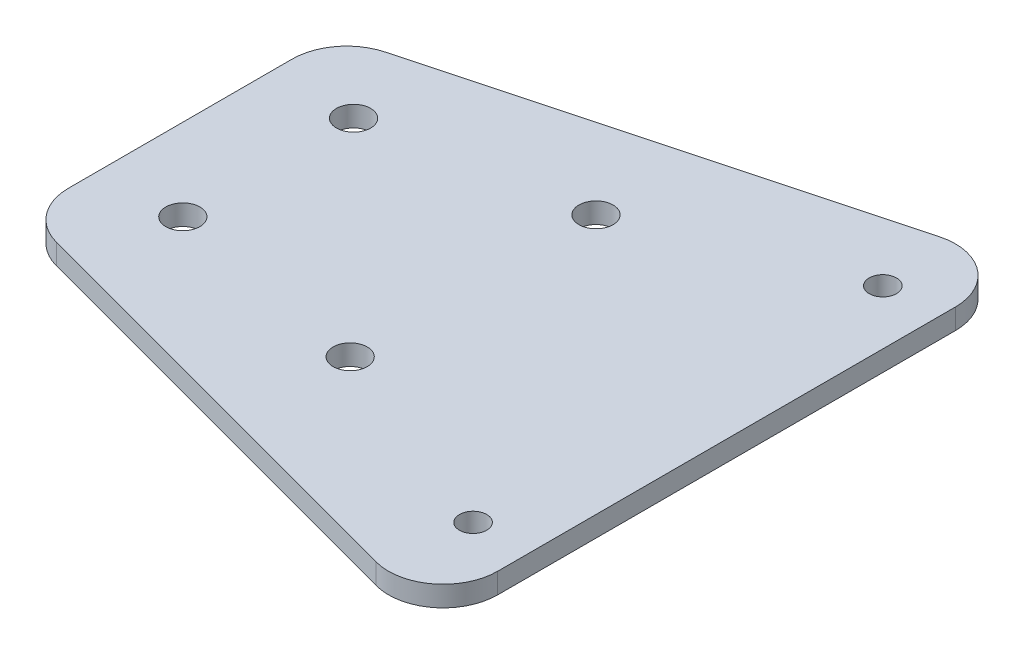
ISO-10303-21;
HEADER;
FILE_DESCRIPTION(('STEP AP214'),'2;1');
FILE_NAME('part.step','',(''),(''),'','','');
FILE_SCHEMA(('AUTOMOTIVE_DESIGN { 1 0 10303 214 1 1 1 1 }'));
ENDSEC;
DATA;
#1=APPLICATION_CONTEXT('core data for automotive mechanical design processes');
#2=APPLICATION_PROTOCOL_DEFINITION('international standard','automotive_design',2000,#1);
#3=PRODUCT_CONTEXT('',#1,'mechanical');
#4=PRODUCT('Part','Part','',(#3));
#5=PRODUCT_RELATED_PRODUCT_CATEGORY('part','',(#4));
#6=PRODUCT_DEFINITION_FORMATION('','',#4);
#7=PRODUCT_DEFINITION_CONTEXT('part definition',#1,'design');
#8=PRODUCT_DEFINITION('design','',#6,#7);
#9=PRODUCT_DEFINITION_SHAPE('','',#8);
#10=(LENGTH_UNIT() NAMED_UNIT(*) SI_UNIT(.MILLI.,.METRE.));
#11=(NAMED_UNIT(*) PLANE_ANGLE_UNIT() SI_UNIT($,.RADIAN.));
#12=(NAMED_UNIT(*) SI_UNIT($,.STERADIAN.) SOLID_ANGLE_UNIT());
#13=UNCERTAINTY_MEASURE_WITH_UNIT(LENGTH_MEASURE(1.E-05),#10,'distance_accuracy_value','');
#14=(GEOMETRIC_REPRESENTATION_CONTEXT(3) GLOBAL_UNCERTAINTY_ASSIGNED_CONTEXT((#13)) GLOBAL_UNIT_ASSIGNED_CONTEXT((#10,
#11,#12)) REPRESENTATION_CONTEXT('',''));
#15=CARTESIAN_POINT('',(0.,0.,0.));
#16=DIRECTION('',(0.,0.,1.));
#17=DIRECTION('',(1.,0.,0.));
#18=AXIS2_PLACEMENT_3D('',#15,#16,#17);
#19=CARTESIAN_POINT('',(-33.4204545454545,1.5,-20.3806449125593));
#20=DIRECTION('',(0.,-1.,0.));
#21=DIRECTION('',(0.,0.,-1.));
#22=AXIS2_PLACEMENT_3D('',#19,#20,#21);
#23=CYLINDRICAL_SURFACE('',#22,8.);
#24=CARTESIAN_POINT('',(-33.4204545454545,-1.5,-20.3806449125593));
#25=DIRECTION('',(0.,1.,0.));
#26=DIRECTION('',(0.,0.,-1.));
#27=AXIS2_PLACEMENT_3D('',#24,#25,#26);
#28=CIRCLE('',#27,8.);
#29=CARTESIAN_POINT('',(-35.4913732101058,-1.5,-28.1079533627506));
#30=VERTEX_POINT('',#29);
#31=CARTESIAN_POINT('',(-41.4204545454545,-1.5,-20.3806449125592));
#32=VERTEX_POINT('',#31);
#33=EDGE_CURVE('E140',#30,#32,#28,.T.);
#34=ORIENTED_EDGE('',*,*,#33,.T.);
#35=DIRECTION('',(0.,-1.,0.));
#36=VECTOR('',#35,1.);
#37=CARTESIAN_POINT('',(-41.4204545454545,1.5,-20.3806449125592));
#38=LINE('',#37,#36);
#39=CARTESIAN_POINT('',(-41.4204545454545,1.5,-20.3806449125592));
#40=VERTEX_POINT('',#39);
#41=EDGE_CURVE('E11',#40,#32,#38,.T.);
#42=ORIENTED_EDGE('',*,*,#41,.F.);
#43=CARTESIAN_POINT('',(-33.4204545454545,1.5,-20.3806449125593));
#44=DIRECTION('',(0.,1.,0.));
#45=DIRECTION('',(0.,0.,-1.));
#46=AXIS2_PLACEMENT_3D('',#43,#44,#45);
#47=CIRCLE('',#46,8.);
#48=CARTESIAN_POINT('',(-35.4913732101058,1.5,-28.1079533627506));
#49=VERTEX_POINT('',#48);
#50=EDGE_CURVE('E155',#49,#40,#47,.T.);
#51=ORIENTED_EDGE('',*,*,#50,.F.);
#52=DIRECTION('',(0.,-1.,0.));
#53=VECTOR('',#52,1.);
#54=CARTESIAN_POINT('',(-35.4913732101058,1.5,-28.1079533627506));
#55=LINE('',#54,#53);
#56=EDGE_CURVE('E133',#49,#30,#55,.T.);
#57=ORIENTED_EDGE('',*,*,#56,.T.);
#58=EDGE_LOOP('',(#34,#42,#51,#57));
#59=FACE_BOUND('',#58,.T.);
#60=ADVANCED_FACE('F41',(#59),#23,.T.);
#61=CARTESIAN_POINT('',(-41.4204545454545,1.5,12.3427257828049));
#62=DIRECTION('',(1.,0.,0.));
#63=DIRECTION('',(0.,0.,-1.));
#64=AXIS2_PLACEMENT_3D('',#61,#62,#63);
#65=PLANE('',#64);
#66=DIRECTION('',(0.,0.,1.));
#67=VECTOR('',#66,1.);
#68=CARTESIAN_POINT('',(-41.4204545454545,-1.5,12.3427257828049));
#69=LINE('',#68,#67);
#70=CARTESIAN_POINT('',(-41.4204545454545,-1.5,12.3427257828049));
#71=VERTEX_POINT('',#70);
#72=EDGE_CURVE('E139',#32,#71,#69,.T.);
#73=ORIENTED_EDGE('',*,*,#72,.T.);
#74=DIRECTION('',(0.,-1.,0.));
#75=VECTOR('',#74,1.);
#76=CARTESIAN_POINT('',(-41.4204545454545,1.5,12.3427257828049));
#77=LINE('',#76,#75);
#78=CARTESIAN_POINT('',(-41.4204545454545,1.5,12.3427257828049));
#79=VERTEX_POINT('',#78);
#80=EDGE_CURVE('E47',#79,#71,#77,.T.);
#81=ORIENTED_EDGE('',*,*,#80,.F.);
#82=DIRECTION('',(0.,0.,1.));
#83=VECTOR('',#82,1.);
#84=CARTESIAN_POINT('',(-41.4204545454545,1.5,12.3427257828049));
#85=LINE('',#84,#83);
#86=EDGE_CURVE('E99',#40,#79,#85,.T.);
#87=ORIENTED_EDGE('',*,*,#86,.F.);
#88=ORIENTED_EDGE('',*,*,#41,.T.);
#89=EDGE_LOOP('',(#73,#81,#87,#88));
#90=FACE_BOUND('',#89,.T.);
#91=ADVANCED_FACE('F263',(#90),#65,.F.);
#92=CARTESIAN_POINT('',(-33.4204545454545,1.5,12.3427257828049));
#93=DIRECTION('',(0.,-1.,0.));
#94=DIRECTION('',(0.,0.,-1.));
#95=AXIS2_PLACEMENT_3D('',#92,#93,#94);
#96=CYLINDRICAL_SURFACE('',#95,8.);
#97=CARTESIAN_POINT('',(-33.4204545454545,-1.5,12.3427257828049));
#98=DIRECTION('',(0.,1.,0.));
#99=DIRECTION('',(0.,0.,1.));
#100=AXIS2_PLACEMENT_3D('',#97,#98,#99);
#101=CIRCLE('',#100,8.);
#102=CARTESIAN_POINT('',(-35.4913732101058,-1.5,20.0700342329963));
#103=VERTEX_POINT('',#102);
#104=EDGE_CURVE('E142',#71,#103,#101,.T.);
#105=ORIENTED_EDGE('',*,*,#104,.T.);
#106=DIRECTION('',(0.,-1.,0.));
#107=VECTOR('',#106,1.);
#108=CARTESIAN_POINT('',(-35.4913732101058,1.5,20.0700342329963));
#109=LINE('',#108,#107);
#110=CARTESIAN_POINT('',(-35.4913732101058,1.5,20.0700342329963));
#111=VERTEX_POINT('',#110);
#112=EDGE_CURVE('E159',#111,#103,#109,.T.);
#113=ORIENTED_EDGE('',*,*,#112,.F.);
#114=CARTESIAN_POINT('',(-33.4204545454545,1.5,12.3427257828049));
#115=DIRECTION('',(0.,1.,0.));
#116=DIRECTION('',(0.,0.,1.));
#117=AXIS2_PLACEMENT_3D('',#114,#115,#116);
#118=CIRCLE('',#117,8.);
#119=EDGE_CURVE('E167',#79,#111,#118,.T.);
#120=ORIENTED_EDGE('',*,*,#119,.F.);
#121=ORIENTED_EDGE('',*,*,#80,.T.);
#122=EDGE_LOOP('',(#105,#113,#120,#121));
#123=FACE_BOUND('',#122,.T.);
#124=ADVANCED_FACE('F161',(#123),#96,.T.);
#125=CARTESIAN_POINT('',(-35.4913732101058,1.5,20.0700342329963));
#126=DIRECTION('',(0.258864833081411,0.,-0.965913556273921));
#127=DIRECTION('',(-0.965913556273921,0.,-0.258864833081411));
#128=AXIS2_PLACEMENT_3D('',#125,#126,#127);
#129=PLANE('',#128);
#130=DIRECTION('',(0.965913556273921,0.,0.258864833081411));
#131=VECTOR('',#130,1.);
#132=CARTESIAN_POINT('',(-35.4913732101058,-1.5,20.0700342329963));
#133=LINE('',#132,#131);
#134=CARTESIAN_POINT('',(28.5086267898941,-1.5,37.2220342329963));
#135=VERTEX_POINT('',#134);
#136=EDGE_CURVE('E144',#103,#135,#133,.T.);
#137=ORIENTED_EDGE('',*,*,#136,.T.);
#138=DIRECTION('',(0.,-1.,0.));
#139=VECTOR('',#138,1.);
#140=CARTESIAN_POINT('',(28.5086267898941,1.5,37.2220342329963));
#141=LINE('',#140,#139);
#142=CARTESIAN_POINT('',(28.5086267898941,1.5,37.2220342329963));
#143=VERTEX_POINT('',#142);
#144=EDGE_CURVE('E157',#143,#135,#141,.T.);
#145=ORIENTED_EDGE('',*,*,#144,.F.);
#146=DIRECTION('',(0.965913556273921,0.,0.258864833081411));
#147=VECTOR('',#146,1.);
#148=CARTESIAN_POINT('',(-35.4913732101058,1.5,20.0700342329963));
#149=LINE('',#148,#147);
#150=EDGE_CURVE('E177',#111,#143,#149,.T.);
#151=ORIENTED_EDGE('',*,*,#150,.F.);
#152=ORIENTED_EDGE('',*,*,#112,.T.);
#153=EDGE_LOOP('',(#137,#145,#151,#152));
#154=FACE_BOUND('',#153,.T.);
#155=ADVANCED_FACE('F172',(#154),#129,.F.);
#156=CARTESIAN_POINT('',(30.5795454545455,1.5,29.4947257828049));
#157=DIRECTION('',(0.,-1.,0.));
#158=DIRECTION('',(0.,0.,-1.));
#159=AXIS2_PLACEMENT_3D('',#156,#157,#158);
#160=CYLINDRICAL_SURFACE('',#159,8.);
#161=CARTESIAN_POINT('',(30.5795454545455,-1.5,29.4947257828049));
#162=DIRECTION('',(0.,1.,0.));
#163=DIRECTION('',(0.,0.,1.));
#164=AXIS2_PLACEMENT_3D('',#161,#162,#163);
#165=CIRCLE('',#164,8.);
#166=CARTESIAN_POINT('',(38.5795454545455,-1.5,29.4947257828048));
#167=VERTEX_POINT('',#166);
#168=EDGE_CURVE('E150',#135,#167,#165,.T.);
#169=ORIENTED_EDGE('',*,*,#168,.T.);
#170=DIRECTION('',(0.,-1.,0.));
#171=VECTOR('',#170,1.);
#172=CARTESIAN_POINT('',(38.5795454545455,1.5,29.4947257828048));
#173=LINE('',#172,#171);
#174=CARTESIAN_POINT('',(38.5795454545455,1.5,29.4947257828048));
#175=VERTEX_POINT('',#174);
#176=EDGE_CURVE('E126',#175,#167,#173,.T.);
#177=ORIENTED_EDGE('',*,*,#176,.F.);
#178=CARTESIAN_POINT('',(30.5795454545455,1.5,29.4947257828049));
#179=DIRECTION('',(0.,1.,0.));
#180=DIRECTION('',(0.,0.,1.));
#181=AXIS2_PLACEMENT_3D('',#178,#179,#180);
#182=CIRCLE('',#181,8.);
#183=EDGE_CURVE('E119',#143,#175,#182,.T.);
#184=ORIENTED_EDGE('',*,*,#183,.F.);
#185=ORIENTED_EDGE('',*,*,#144,.T.);
#186=EDGE_LOOP('',(#169,#177,#184,#185));
#187=FACE_BOUND('',#186,.T.);
#188=ADVANCED_FACE('F178',(#187),#160,.T.);
#189=CARTESIAN_POINT('',(38.5795454545455,1.5,-37.5326449125592));
#190=DIRECTION('',(-1.,0.,0.));
#191=DIRECTION('',(0.,0.,1.));
#192=AXIS2_PLACEMENT_3D('',#189,#190,#191);
#193=PLANE('',#192);
#194=DIRECTION('',(0.,0.,-1.));
#195=VECTOR('',#194,1.);
#196=CARTESIAN_POINT('',(38.5795454545455,-1.5,-37.5326449125592));
#197=LINE('',#196,#195);
#198=CARTESIAN_POINT('',(38.5795454545455,-1.5,-37.5326449125592));
#199=VERTEX_POINT('',#198);
#200=EDGE_CURVE('E130',#167,#199,#197,.T.);
#201=ORIENTED_EDGE('',*,*,#200,.T.);
#202=DIRECTION('',(0.,-1.,0.));
#203=VECTOR('',#202,1.);
#204=CARTESIAN_POINT('',(38.5795454545455,1.5,-37.5326449125592));
#205=LINE('',#204,#203);
#206=CARTESIAN_POINT('',(38.5795454545455,1.5,-37.5326449125592));
#207=VERTEX_POINT('',#206);
#208=EDGE_CURVE('E125',#207,#199,#205,.T.);
#209=ORIENTED_EDGE('',*,*,#208,.F.);
#210=DIRECTION('',(0.,0.,-1.));
#211=VECTOR('',#210,1.);
#212=CARTESIAN_POINT('',(38.5795454545455,1.5,-37.5326449125592));
#213=LINE('',#212,#211);
#214=EDGE_CURVE('E111',#175,#207,#213,.T.);
#215=ORIENTED_EDGE('',*,*,#214,.F.);
#216=ORIENTED_EDGE('',*,*,#176,.T.);
#217=EDGE_LOOP('',(#201,#209,#215,#216));
#218=FACE_BOUND('',#217,.T.);
#219=ADVANCED_FACE('F124',(#218),#193,.F.);
#220=CARTESIAN_POINT('',(30.5795454545455,1.5,-37.5326449125593));
#221=DIRECTION('',(0.,-1.,0.));
#222=DIRECTION('',(0.,0.,-1.));
#223=AXIS2_PLACEMENT_3D('',#220,#221,#222);
#224=CYLINDRICAL_SURFACE('',#223,8.);
#225=CARTESIAN_POINT('',(30.5795454545455,-1.5,-37.5326449125593));
#226=DIRECTION('',(0.,1.,0.));
#227=DIRECTION('',(0.,0.,-1.));
#228=AXIS2_PLACEMENT_3D('',#225,#226,#227);
#229=CIRCLE('',#228,8.);
#230=CARTESIAN_POINT('',(28.5086267898941,-1.5,-45.2599533627506));
#231=VERTEX_POINT('',#230);
#232=EDGE_CURVE('E86',#199,#231,#229,.T.);
#233=ORIENTED_EDGE('',*,*,#232,.T.);
#234=DIRECTION('',(0.,-1.,0.));
#235=VECTOR('',#234,1.);
#236=CARTESIAN_POINT('',(28.5086267898941,1.5,-45.2599533627506));
#237=LINE('',#236,#235);
#238=CARTESIAN_POINT('',(28.5086267898941,1.5,-45.2599533627506));
#239=VERTEX_POINT('',#238);
#240=EDGE_CURVE('E129',#239,#231,#237,.T.);
#241=ORIENTED_EDGE('',*,*,#240,.F.);
#242=CARTESIAN_POINT('',(30.5795454545455,1.5,-37.5326449125593));
#243=DIRECTION('',(0.,1.,0.));
#244=DIRECTION('',(0.,0.,-1.));
#245=AXIS2_PLACEMENT_3D('',#242,#243,#244);
#246=CIRCLE('',#245,8.);
#247=EDGE_CURVE('E120',#207,#239,#246,.T.);
#248=ORIENTED_EDGE('',*,*,#247,.F.);
#249=ORIENTED_EDGE('',*,*,#208,.T.);
#250=EDGE_LOOP('',(#233,#241,#248,#249));
#251=FACE_BOUND('',#250,.T.);
#252=ADVANCED_FACE('F131',(#251),#224,.T.);
#253=CARTESIAN_POINT('',(-35.4913732101058,1.5,-28.1079533627506));
#254=DIRECTION('',(0.258864833081411,0.,0.965913556273921));
#255=DIRECTION('',(0.965913556273921,0.,-0.258864833081411));
#256=AXIS2_PLACEMENT_3D('',#253,#254,#255);
#257=PLANE('',#256);
#258=DIRECTION('',(-0.965913556273921,0.,0.258864833081411));
#259=VECTOR('',#258,1.);
#260=CARTESIAN_POINT('',(-35.4913732101058,-1.5,-28.1079533627506));
#261=LINE('',#260,#259);
#262=EDGE_CURVE('E95',#231,#30,#261,.T.);
#263=ORIENTED_EDGE('',*,*,#262,.T.);
#264=ORIENTED_EDGE('',*,*,#56,.F.);
#265=DIRECTION('',(-0.965913556273921,0.,0.258864833081411));
#266=VECTOR('',#265,1.);
#267=CARTESIAN_POINT('',(-35.4913732101058,1.5,-28.1079533627506));
#268=LINE('',#267,#266);
#269=EDGE_CURVE('E60',#239,#49,#268,.T.);
#270=ORIENTED_EDGE('',*,*,#269,.F.);
#271=ORIENTED_EDGE('',*,*,#240,.T.);
#272=EDGE_LOOP('',(#263,#264,#270,#271));
#273=FACE_BOUND('',#272,.T.);
#274=ADVANCED_FACE('F235',(#273),#257,.F.);
#275=CARTESIAN_POINT('',(-33.4204545454545,1.5,-20.3806449125593));
#276=DIRECTION('',(0.,-1.,0.));
#277=DIRECTION('',(0.,0.,-1.));
#278=AXIS2_PLACEMENT_3D('',#275,#276,#277);
#279=PLANE('',#278);
#280=CARTESIAN_POINT('',(30.5795454545455,1.5,-34.8941525518892));
#281=DIRECTION('',(0.,1.,0.));
#282=DIRECTION('',(0.,0.,1.));
#283=AXIS2_PLACEMENT_3D('',#280,#281,#282);
#284=CIRCLE('',#283,2.);
#285=CARTESIAN_POINT('',(30.5795454545455,1.5,-32.8941525518892));
#286=VERTEX_POINT('',#285);
#287=EDGE_CURVE('E206',#286,#286,#284,.T.);
#288=ORIENTED_EDGE('',*,*,#287,.F.);
#289=EDGE_LOOP('',(#288));
#290=FACE_BOUND('',#289,.T.);
#291=CARTESIAN_POINT('',(-29.4204545454545,1.5,7.60584744811078));
#292=DIRECTION('',(0.,1.,0.));
#293=DIRECTION('',(0.,0.,-1.));
#294=AXIS2_PLACEMENT_3D('',#291,#292,#293);
#295=CIRCLE('',#294,2.5);
#296=CARTESIAN_POINT('',(-29.4204545454545,1.5,5.10584744811078));
#297=VERTEX_POINT('',#296);
#298=EDGE_CURVE('E188',#297,#297,#295,.T.);
#299=ORIENTED_EDGE('',*,*,#298,.F.);
#300=EDGE_LOOP('',(#299));
#301=FACE_BOUND('',#300,.T.);
#302=CARTESIAN_POINT('',(0.579545454545478,1.5,13.1058474481108));
#303=DIRECTION('',(0.,1.,0.));
#304=DIRECTION('',(0.,0.,-1.));
#305=AXIS2_PLACEMENT_3D('',#302,#303,#304);
#306=CIRCLE('',#305,2.5);
#307=CARTESIAN_POINT('',(0.579545454545478,1.5,10.6058474481108));
#308=VERTEX_POINT('',#307);
#309=EDGE_CURVE('E187',#308,#308,#306,.T.);
#310=ORIENTED_EDGE('',*,*,#309,.F.);
#311=EDGE_LOOP('',(#310));
#312=FACE_BOUND('',#311,.T.);
#313=CARTESIAN_POINT('',(30.5795454545455,1.5,25.1058474481108));
#314=DIRECTION('',(0.,1.,0.));
#315=DIRECTION('',(0.,0.,-1.));
#316=AXIS2_PLACEMENT_3D('',#313,#314,#315);
#317=CIRCLE('',#316,2.);
#318=CARTESIAN_POINT('',(30.5795454545455,1.5,23.1058474481108));
#319=VERTEX_POINT('',#318);
#320=EDGE_CURVE('E193',#319,#319,#317,.T.);
#321=ORIENTED_EDGE('',*,*,#320,.F.);
#322=EDGE_LOOP('',(#321));
#323=FACE_BOUND('',#322,.T.);
#324=CARTESIAN_POINT('',(-29.4204545454545,1.5,-17.3941525518892));
#325=DIRECTION('',(0.,1.,0.));
#326=DIRECTION('',(0.,0.,1.));
#327=AXIS2_PLACEMENT_3D('',#324,#325,#326);
#328=CIRCLE('',#327,2.5);
#329=CARTESIAN_POINT('',(-29.4204545454545,1.5,-14.8941525518892));
#330=VERTEX_POINT('',#329);
#331=EDGE_CURVE('E202',#330,#330,#328,.T.);
#332=ORIENTED_EDGE('',*,*,#331,.F.);
#333=EDGE_LOOP('',(#332));
#334=FACE_BOUND('',#333,.T.);
#335=CARTESIAN_POINT('',(0.579545454545478,1.5,-22.8941525518892));
#336=DIRECTION('',(0.,1.,0.));
#337=DIRECTION('',(0.,0.,1.));
#338=AXIS2_PLACEMENT_3D('',#335,#336,#337);
#339=CIRCLE('',#338,2.5);
#340=CARTESIAN_POINT('',(0.579545454545478,1.5,-20.3941525518892));
#341=VERTEX_POINT('',#340);
#342=EDGE_CURVE('E210',#341,#341,#339,.T.);
#343=ORIENTED_EDGE('',*,*,#342,.F.);
#344=EDGE_LOOP('',(#343));
#345=FACE_BOUND('',#344,.T.);
#346=ORIENTED_EDGE('',*,*,#50,.T.);
#347=ORIENTED_EDGE('',*,*,#86,.T.);
#348=ORIENTED_EDGE('',*,*,#119,.T.);
#349=ORIENTED_EDGE('',*,*,#150,.T.);
#350=ORIENTED_EDGE('',*,*,#183,.T.);
#351=ORIENTED_EDGE('',*,*,#214,.T.);
#352=ORIENTED_EDGE('',*,*,#247,.T.);
#353=ORIENTED_EDGE('',*,*,#269,.T.);
#354=EDGE_LOOP('',(#346,#347,#348,#349,#350,#351,#352,#353));
#355=FACE_BOUND('',#354,.T.);
#356=ADVANCED_FACE('F113',(#290,#301,#312,#323,#334,#345,#355),#279,.F.);
#357=CARTESIAN_POINT('',(-33.4204545454545,-1.5,-20.3806449125593));
#358=DIRECTION('',(0.,-1.,0.));
#359=DIRECTION('',(0.,0.,-1.));
#360=AXIS2_PLACEMENT_3D('',#357,#358,#359);
#361=PLANE('',#360);
#362=CARTESIAN_POINT('',(30.5795454545455,-1.5,-34.8941525518892));
#363=DIRECTION('',(0.,1.,0.));
#364=DIRECTION('',(0.,0.,1.));
#365=AXIS2_PLACEMENT_3D('',#362,#363,#364);
#366=CIRCLE('',#365,2.);
#367=CARTESIAN_POINT('',(30.5795454545455,-1.5,-32.8941525518892));
#368=VERTEX_POINT('',#367);
#369=EDGE_CURVE('E141',#368,#368,#366,.T.);
#370=ORIENTED_EDGE('',*,*,#369,.T.);
#371=EDGE_LOOP('',(#370));
#372=FACE_BOUND('',#371,.T.);
#373=CARTESIAN_POINT('',(-29.4204545454545,-1.5,7.60584744811078));
#374=DIRECTION('',(0.,1.,0.));
#375=DIRECTION('',(0.,0.,-1.));
#376=AXIS2_PLACEMENT_3D('',#373,#374,#375);
#377=CIRCLE('',#376,2.5);
#378=CARTESIAN_POINT('',(-29.4204545454545,-1.5,5.10584744811078));
#379=VERTEX_POINT('',#378);
#380=EDGE_CURVE('E213',#379,#379,#377,.T.);
#381=ORIENTED_EDGE('',*,*,#380,.T.);
#382=EDGE_LOOP('',(#381));
#383=FACE_BOUND('',#382,.T.);
#384=CARTESIAN_POINT('',(0.579545454545478,-1.5,13.1058474481108));
#385=DIRECTION('',(0.,1.,0.));
#386=DIRECTION('',(0.,0.,-1.));
#387=AXIS2_PLACEMENT_3D('',#384,#385,#386);
#388=CIRCLE('',#387,2.5);
#389=CARTESIAN_POINT('',(0.579545454545478,-1.5,10.6058474481108));
#390=VERTEX_POINT('',#389);
#391=EDGE_CURVE('E184',#390,#390,#388,.T.);
#392=ORIENTED_EDGE('',*,*,#391,.T.);
#393=EDGE_LOOP('',(#392));
#394=FACE_BOUND('',#393,.T.);
#395=CARTESIAN_POINT('',(30.5795454545455,-1.5,25.1058474481108));
#396=DIRECTION('',(0.,1.,0.));
#397=DIRECTION('',(0.,0.,-1.));
#398=AXIS2_PLACEMENT_3D('',#395,#396,#397);
#399=CIRCLE('',#398,2.);
#400=CARTESIAN_POINT('',(30.5795454545455,-1.5,23.1058474481108));
#401=VERTEX_POINT('',#400);
#402=EDGE_CURVE('E195',#401,#401,#399,.T.);
#403=ORIENTED_EDGE('',*,*,#402,.T.);
#404=EDGE_LOOP('',(#403));
#405=FACE_BOUND('',#404,.T.);
#406=CARTESIAN_POINT('',(-29.4204545454545,-1.5,-17.3941525518892));
#407=DIRECTION('',(0.,1.,0.));
#408=DIRECTION('',(0.,0.,1.));
#409=AXIS2_PLACEMENT_3D('',#406,#407,#408);
#410=CIRCLE('',#409,2.5);
#411=CARTESIAN_POINT('',(-29.4204545454545,-1.5,-14.8941525518892));
#412=VERTEX_POINT('',#411);
#413=EDGE_CURVE('E198',#412,#412,#410,.T.);
#414=ORIENTED_EDGE('',*,*,#413,.T.);
#415=EDGE_LOOP('',(#414));
#416=FACE_BOUND('',#415,.T.);
#417=CARTESIAN_POINT('',(0.579545454545478,-1.5,-22.8941525518892));
#418=DIRECTION('',(0.,1.,0.));
#419=DIRECTION('',(0.,0.,1.));
#420=AXIS2_PLACEMENT_3D('',#417,#418,#419);
#421=CIRCLE('',#420,2.5);
#422=CARTESIAN_POINT('',(0.579545454545478,-1.5,-20.3941525518892));
#423=VERTEX_POINT('',#422);
#424=EDGE_CURVE('E204',#423,#423,#421,.T.);
#425=ORIENTED_EDGE('',*,*,#424,.T.);
#426=EDGE_LOOP('',(#425));
#427=FACE_BOUND('',#426,.T.);
#428=ORIENTED_EDGE('',*,*,#33,.F.);
#429=ORIENTED_EDGE('',*,*,#262,.F.);
#430=ORIENTED_EDGE('',*,*,#232,.F.);
#431=ORIENTED_EDGE('',*,*,#200,.F.);
#432=ORIENTED_EDGE('',*,*,#168,.F.);
#433=ORIENTED_EDGE('',*,*,#136,.F.);
#434=ORIENTED_EDGE('',*,*,#104,.F.);
#435=ORIENTED_EDGE('',*,*,#72,.F.);
#436=EDGE_LOOP('',(#428,#429,#430,#431,#432,#433,#434,#435));
#437=FACE_BOUND('',#436,.T.);
#438=ADVANCED_FACE('F173',(#372,#383,#394,#405,#416,#427,#437),#361,.T.);
#439=CARTESIAN_POINT('',(0.579545454545478,-1.5,-22.8941525518892));
#440=DIRECTION('',(0.,1.,0.));
#441=DIRECTION('',(0.,0.,1.));
#442=AXIS2_PLACEMENT_3D('',#439,#440,#441);
#443=CYLINDRICAL_SURFACE('',#442,2.5);
#444=ORIENTED_EDGE('',*,*,#424,.F.);
#445=EDGE_LOOP('',(#444));
#446=FACE_BOUND('',#445,.T.);
#447=ORIENTED_EDGE('',*,*,#342,.T.);
#448=EDGE_LOOP('',(#447));
#449=FACE_BOUND('',#448,.T.);
#450=ADVANCED_FACE('F244',(#446,#449),#443,.F.);
#451=CARTESIAN_POINT('',(-29.4204545454545,-1.5,-17.3941525518892));
#452=DIRECTION('',(0.,1.,0.));
#453=DIRECTION('',(0.,0.,1.));
#454=AXIS2_PLACEMENT_3D('',#451,#452,#453);
#455=CYLINDRICAL_SURFACE('',#454,2.5);
#456=ORIENTED_EDGE('',*,*,#413,.F.);
#457=EDGE_LOOP('',(#456));
#458=FACE_BOUND('',#457,.T.);
#459=ORIENTED_EDGE('',*,*,#331,.T.);
#460=EDGE_LOOP('',(#459));
#461=FACE_BOUND('',#460,.T.);
#462=ADVANCED_FACE('F247',(#458,#461),#455,.F.);
#463=CARTESIAN_POINT('',(30.5795454545455,-1.5,25.1058474481108));
#464=DIRECTION('',(0.,1.,0.));
#465=DIRECTION('',(0.,0.,1.));
#466=AXIS2_PLACEMENT_3D('',#463,#464,#465);
#467=CYLINDRICAL_SURFACE('',#466,2.);
#468=ORIENTED_EDGE('',*,*,#402,.F.);
#469=EDGE_LOOP('',(#468));
#470=FACE_BOUND('',#469,.T.);
#471=ORIENTED_EDGE('',*,*,#320,.T.);
#472=EDGE_LOOP('',(#471));
#473=FACE_BOUND('',#472,.T.);
#474=ADVANCED_FACE('F253',(#470,#473),#467,.F.);
#475=CARTESIAN_POINT('',(0.579545454545478,-1.5,13.1058474481108));
#476=DIRECTION('',(0.,1.,0.));
#477=DIRECTION('',(0.,0.,1.));
#478=AXIS2_PLACEMENT_3D('',#475,#476,#477);
#479=CYLINDRICAL_SURFACE('',#478,2.5);
#480=ORIENTED_EDGE('',*,*,#391,.F.);
#481=EDGE_LOOP('',(#480));
#482=FACE_BOUND('',#481,.T.);
#483=ORIENTED_EDGE('',*,*,#309,.T.);
#484=EDGE_LOOP('',(#483));
#485=FACE_BOUND('',#484,.T.);
#486=ADVANCED_FACE('F354',(#482,#485),#479,.F.);
#487=CARTESIAN_POINT('',(-29.4204545454545,-1.5,7.60584744811078));
#488=DIRECTION('',(0.,1.,0.));
#489=DIRECTION('',(0.,0.,1.));
#490=AXIS2_PLACEMENT_3D('',#487,#488,#489);
#491=CYLINDRICAL_SURFACE('',#490,2.5);
#492=ORIENTED_EDGE('',*,*,#380,.F.);
#493=EDGE_LOOP('',(#492));
#494=FACE_BOUND('',#493,.T.);
#495=ORIENTED_EDGE('',*,*,#298,.T.);
#496=EDGE_LOOP('',(#495));
#497=FACE_BOUND('',#496,.T.);
#498=ADVANCED_FACE('F226',(#494,#497),#491,.F.);
#499=CARTESIAN_POINT('',(30.5795454545455,-1.5,-34.8941525518892));
#500=DIRECTION('',(0.,1.,0.));
#501=DIRECTION('',(0.,0.,1.));
#502=AXIS2_PLACEMENT_3D('',#499,#500,#501);
#503=CYLINDRICAL_SURFACE('',#502,2.);
#504=ORIENTED_EDGE('',*,*,#369,.F.);
#505=EDGE_LOOP('',(#504));
#506=FACE_BOUND('',#505,.T.);
#507=ORIENTED_EDGE('',*,*,#287,.T.);
#508=EDGE_LOOP('',(#507));
#509=FACE_BOUND('',#508,.T.);
#510=ADVANCED_FACE('F223',(#506,#509),#503,.F.);
#511=CLOSED_SHELL('',(#60,#91,#124,#155,#188,#219,#252,#274,#356,#438,#450,#462,#474,#486,#498,#510));
#512=MANIFOLD_SOLID_BREP('B2',#511);
#513=ADVANCED_BREP_SHAPE_REPRESENTATION('',(#18,#512),#14);
#514=SHAPE_DEFINITION_REPRESENTATION(#9,#513);
ENDSEC;
END-ISO-10303-21;
